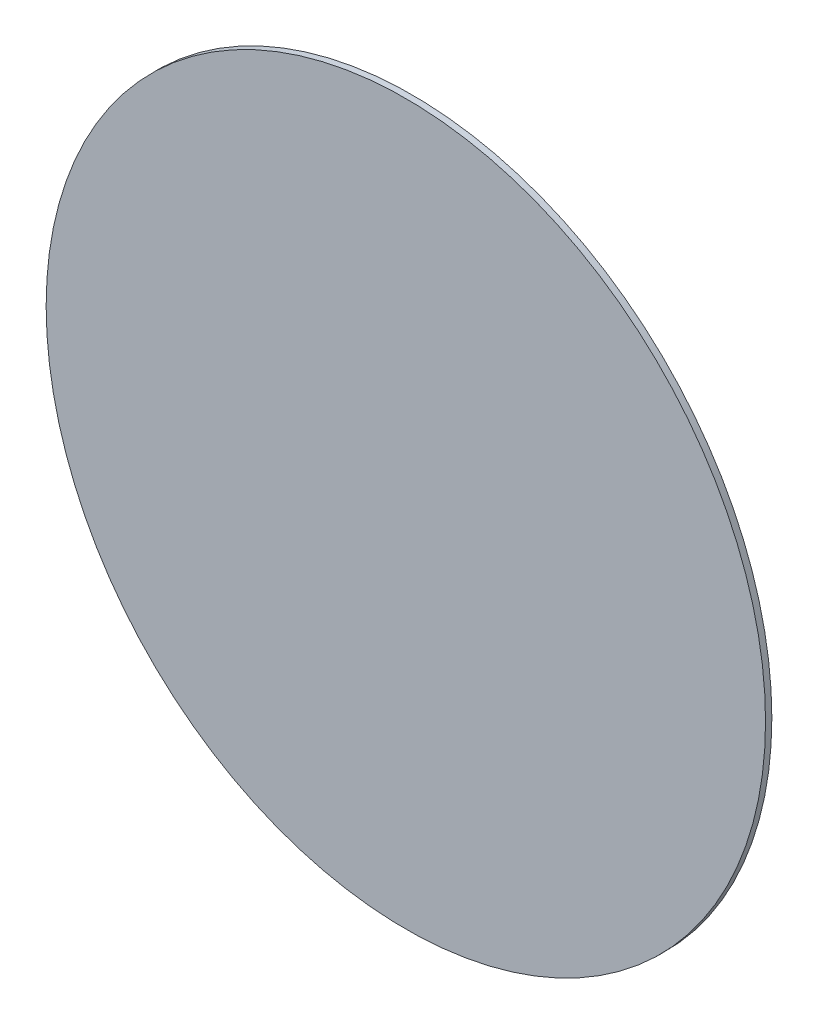
ISO-10303-21;
HEADER;
FILE_DESCRIPTION(('STEP AP214'),'2;1');
FILE_NAME('part.step','',(''),(''),'','','');
FILE_SCHEMA(('AUTOMOTIVE_DESIGN { 1 0 10303 214 1 1 1 1 }'));
ENDSEC;
DATA;
#1=APPLICATION_CONTEXT('core data for automotive mechanical design processes');
#2=APPLICATION_PROTOCOL_DEFINITION('international standard','automotive_design',2000,#1);
#3=PRODUCT_CONTEXT('',#1,'mechanical');
#4=PRODUCT('Part','Part','',(#3));
#5=PRODUCT_RELATED_PRODUCT_CATEGORY('part','',(#4));
#6=PRODUCT_DEFINITION_FORMATION('','',#4);
#7=PRODUCT_DEFINITION_CONTEXT('part definition',#1,'design');
#8=PRODUCT_DEFINITION('design','',#6,#7);
#9=PRODUCT_DEFINITION_SHAPE('','',#8);
#10=(LENGTH_UNIT() NAMED_UNIT(*) SI_UNIT(.MILLI.,.METRE.));
#11=(NAMED_UNIT(*) PLANE_ANGLE_UNIT() SI_UNIT($,.RADIAN.));
#12=(NAMED_UNIT(*) SI_UNIT($,.STERADIAN.) SOLID_ANGLE_UNIT());
#13=UNCERTAINTY_MEASURE_WITH_UNIT(LENGTH_MEASURE(1.E-05),#10,'distance_accuracy_value','');
#14=(GEOMETRIC_REPRESENTATION_CONTEXT(3) GLOBAL_UNCERTAINTY_ASSIGNED_CONTEXT((#13)) GLOBAL_UNIT_ASSIGNED_CONTEXT((#10,
#11,#12)) REPRESENTATION_CONTEXT('',''));
#15=CARTESIAN_POINT('',(0.,0.,0.));
#16=DIRECTION('',(0.,0.,1.));
#17=DIRECTION('',(1.,0.,0.));
#18=AXIS2_PLACEMENT_3D('',#15,#16,#17);
#19=CARTESIAN_POINT('',(0.,0.,2.));
#20=DIRECTION('',(0.,0.,-1.));
#21=DIRECTION('',(-1.,0.,0.));
#22=AXIS2_PLACEMENT_3D('',#19,#20,#21);
#23=CYLINDRICAL_SURFACE('',#22,114.);
#24=CARTESIAN_POINT('',(0.,0.,2.));
#25=DIRECTION('',(0.,0.,1.));
#26=DIRECTION('',(1.,0.,0.));
#27=AXIS2_PLACEMENT_3D('',#24,#25,#26);
#28=CIRCLE('',#27,114.);
#29=CARTESIAN_POINT('',(114.,0.,2.));
#30=VERTEX_POINT('',#29);
#31=EDGE_CURVE('E10',#30,#30,#28,.T.);
#32=ORIENTED_EDGE('',*,*,#31,.F.);
#33=EDGE_LOOP('',(#32));
#34=FACE_BOUND('',#33,.T.);
#35=CARTESIAN_POINT('',(0.,0.,0.));
#36=DIRECTION('',(0.,0.,1.));
#37=DIRECTION('',(1.,0.,0.));
#38=AXIS2_PLACEMENT_3D('',#35,#36,#37);
#39=CIRCLE('',#38,114.);
#40=CARTESIAN_POINT('',(114.,0.,0.));
#41=VERTEX_POINT('',#40);
#42=EDGE_CURVE('E40',#41,#41,#39,.T.);
#43=ORIENTED_EDGE('',*,*,#42,.T.);
#44=EDGE_LOOP('',(#43));
#45=FACE_BOUND('',#44,.T.);
#46=ADVANCED_FACE('F37',(#34,#45),#23,.T.);
#47=CARTESIAN_POINT('',(0.,0.,2.));
#48=DIRECTION('',(0.,0.,1.));
#49=DIRECTION('',(1.,0.,0.));
#50=AXIS2_PLACEMENT_3D('',#47,#48,#49);
#51=PLANE('',#50);
#52=ORIENTED_EDGE('',*,*,#31,.T.);
#53=EDGE_LOOP('',(#52));
#54=FACE_BOUND('',#53,.T.);
#55=ADVANCED_FACE('F52',(#54),#51,.T.);
#56=CARTESIAN_POINT('',(0.,0.,0.));
#57=DIRECTION('',(0.,0.,1.));
#58=DIRECTION('',(1.,0.,0.));
#59=AXIS2_PLACEMENT_3D('',#56,#57,#58);
#60=PLANE('',#59);
#61=ORIENTED_EDGE('',*,*,#42,.F.);
#62=EDGE_LOOP('',(#61));
#63=FACE_BOUND('',#62,.T.);
#64=ADVANCED_FACE('F50',(#63),#60,.F.);
#65=CLOSED_SHELL('',(#46,#55,#64));
#66=MANIFOLD_SOLID_BREP('B2',#65);
#67=ADVANCED_BREP_SHAPE_REPRESENTATION('',(#18,#66),#14);
#68=SHAPE_DEFINITION_REPRESENTATION(#9,#67);
ENDSEC;
END-ISO-10303-21;
